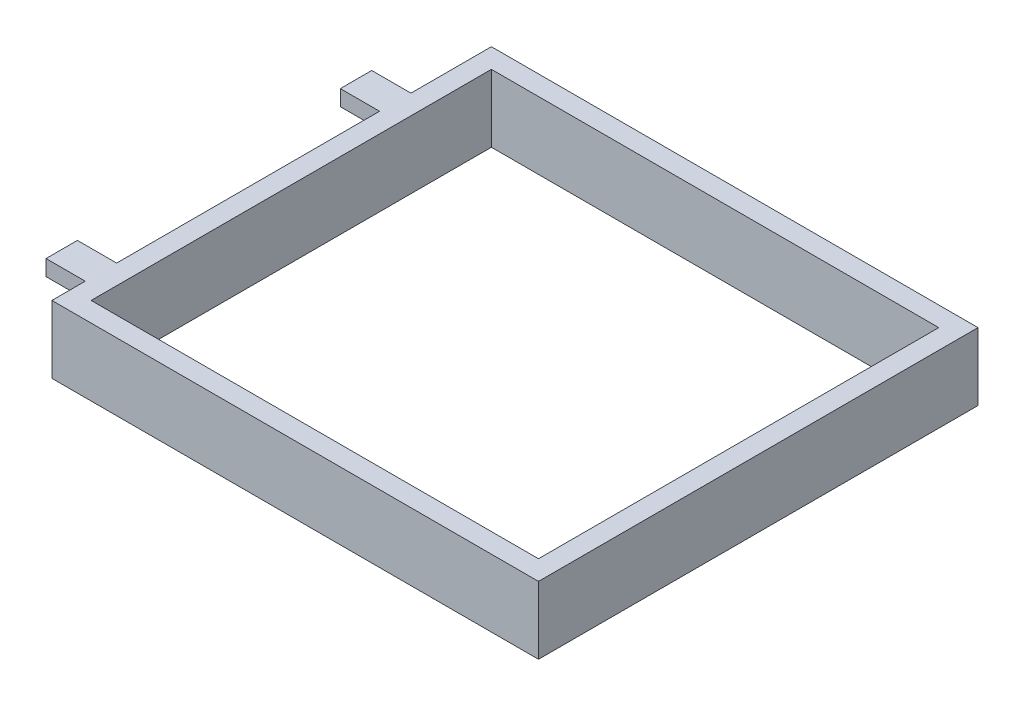
ISO-10303-21;
HEADER;
FILE_DESCRIPTION(('STEP AP214'),'2;1');
FILE_NAME('part.step','',(''),(''),'','','');
FILE_SCHEMA(('AUTOMOTIVE_DESIGN { 1 0 10303 214 1 1 1 1 }'));
ENDSEC;
DATA;
#1=APPLICATION_CONTEXT('core data for automotive mechanical design processes');
#2=APPLICATION_PROTOCOL_DEFINITION('international standard','automotive_design',2000,#1);
#3=PRODUCT_CONTEXT('',#1,'mechanical');
#4=PRODUCT('Part','Part','',(#3));
#5=PRODUCT_RELATED_PRODUCT_CATEGORY('part','',(#4));
#6=PRODUCT_DEFINITION_FORMATION('','',#4);
#7=PRODUCT_DEFINITION_CONTEXT('part definition',#1,'design');
#8=PRODUCT_DEFINITION('design','',#6,#7);
#9=PRODUCT_DEFINITION_SHAPE('','',#8);
#10=(LENGTH_UNIT() NAMED_UNIT(*) SI_UNIT(.MILLI.,.METRE.));
#11=(NAMED_UNIT(*) PLANE_ANGLE_UNIT() SI_UNIT($,.RADIAN.));
#12=(NAMED_UNIT(*) SI_UNIT($,.STERADIAN.) SOLID_ANGLE_UNIT());
#13=UNCERTAINTY_MEASURE_WITH_UNIT(LENGTH_MEASURE(1.E-05),#10,'distance_accuracy_value','');
#14=(GEOMETRIC_REPRESENTATION_CONTEXT(3) GLOBAL_UNCERTAINTY_ASSIGNED_CONTEXT((#13)) GLOBAL_UNIT_ASSIGNED_CONTEXT((#10,
#11,#12)) REPRESENTATION_CONTEXT('',''));
#15=CARTESIAN_POINT('',(0.,0.,0.));
#16=DIRECTION('',(0.,0.,1.));
#17=DIRECTION('',(1.,0.,0.));
#18=AXIS2_PLACEMENT_3D('',#15,#16,#17);
#19=CARTESIAN_POINT('',(0.,43.,0.));
#20=DIRECTION('',(1.,0.,0.));
#21=DIRECTION('',(0.,0.,-1.));
#22=AXIS2_PLACEMENT_3D('',#19,#20,#21);
#23=PLANE('',#22);
#24=DIRECTION('',(0.,-1.,0.));
#25=VECTOR('',#24,1.);
#26=CARTESIAN_POINT('',(0.,43.,-41.25));
#27=LINE('',#26,#25);
#28=CARTESIAN_POINT('',(0.,43.,-41.25));
#29=VERTEX_POINT('',#28);
#30=CARTESIAN_POINT('',(0.,33.,-41.25));
#31=VERTEX_POINT('',#30);
#32=EDGE_CURVE('E170',#29,#31,#27,.T.);
#33=ORIENTED_EDGE('',*,*,#32,.F.);
#34=DIRECTION('',(0.,0.,1.));
#35=VECTOR('',#34,1.);
#36=CARTESIAN_POINT('',(0.,43.,0.));
#37=LINE('',#36,#35);
#38=CARTESIAN_POINT('',(0.,43.,-208.75));
#39=VERTEX_POINT('',#38);
#40=EDGE_CURVE('E239',#39,#29,#37,.T.);
#41=ORIENTED_EDGE('',*,*,#40,.F.);
#42=DIRECTION('',(0.,1.,0.));
#43=VECTOR('',#42,1.);
#44=CARTESIAN_POINT('',(0.,43.,-208.75));
#45=LINE('',#44,#43);
#46=CARTESIAN_POINT('',(0.,33.,-208.75));
#47=VERTEX_POINT('',#46);
#48=EDGE_CURVE('E183',#47,#39,#45,.T.);
#49=ORIENTED_EDGE('',*,*,#48,.F.);
#50=DIRECTION('',(0.,0.,1.));
#51=VECTOR('',#50,1.);
#52=CARTESIAN_POINT('',(0.,33.,-228.75));
#53=LINE('',#52,#51);
#54=CARTESIAN_POINT('',(0.,33.,-228.75));
#55=VERTEX_POINT('',#54);
#56=EDGE_CURVE('E58',#55,#47,#53,.T.);
#57=ORIENTED_EDGE('',*,*,#56,.F.);
#58=DIRECTION('',(0.,-1.,0.));
#59=VECTOR('',#58,1.);
#60=CARTESIAN_POINT('',(0.,43.,-228.75));
#61=LINE('',#60,#59);
#62=CARTESIAN_POINT('',(0.,43.,-228.75));
#63=VERTEX_POINT('',#62);
#64=EDGE_CURVE('E172',#63,#55,#61,.T.);
#65=ORIENTED_EDGE('',*,*,#64,.F.);
#66=CARTESIAN_POINT('',(0.,43.,-280.));
#67=VERTEX_POINT('',#66);
#68=EDGE_CURVE('E235',#67,#63,#37,.T.);
#69=ORIENTED_EDGE('',*,*,#68,.F.);
#70=DIRECTION('',(0.,-1.,0.));
#71=VECTOR('',#70,1.);
#72=CARTESIAN_POINT('',(0.,43.,-280.));
#73=LINE('',#72,#71);
#74=CARTESIAN_POINT('',(0.,0.,-280.));
#75=VERTEX_POINT('',#74);
#76=EDGE_CURVE('E246',#67,#75,#73,.T.);
#77=ORIENTED_EDGE('',*,*,#76,.T.);
#78=DIRECTION('',(0.,0.,1.));
#79=VECTOR('',#78,1.);
#80=CARTESIAN_POINT('',(0.,0.,0.));
#81=LINE('',#80,#79);
#82=CARTESIAN_POINT('',(0.,0.,0.));
#83=VERTEX_POINT('',#82);
#84=EDGE_CURVE('E234',#75,#83,#81,.T.);
#85=ORIENTED_EDGE('',*,*,#84,.T.);
#86=DIRECTION('',(0.,-1.,0.));
#87=VECTOR('',#86,1.);
#88=CARTESIAN_POINT('',(0.,43.,0.));
#89=LINE('',#88,#87);
#90=CARTESIAN_POINT('',(0.,43.,0.));
#91=VERTEX_POINT('',#90);
#92=EDGE_CURVE('E11',#91,#83,#89,.T.);
#93=ORIENTED_EDGE('',*,*,#92,.F.);
#94=CARTESIAN_POINT('',(0.,43.,-21.25));
#95=VERTEX_POINT('',#94);
#96=EDGE_CURVE('E240',#95,#91,#37,.T.);
#97=ORIENTED_EDGE('',*,*,#96,.F.);
#98=DIRECTION('',(0.,1.,0.));
#99=VECTOR('',#98,1.);
#100=CARTESIAN_POINT('',(0.,43.,-21.25));
#101=LINE('',#100,#99);
#102=CARTESIAN_POINT('',(0.,33.,-21.25));
#103=VERTEX_POINT('',#102);
#104=EDGE_CURVE('E166',#103,#95,#101,.T.);
#105=ORIENTED_EDGE('',*,*,#104,.F.);
#106=DIRECTION('',(0.,0.,1.));
#107=VECTOR('',#106,1.);
#108=CARTESIAN_POINT('',(0.,33.,-41.25));
#109=LINE('',#108,#107);
#110=EDGE_CURVE('E328',#31,#103,#109,.T.);
#111=ORIENTED_EDGE('',*,*,#110,.F.);
#112=EDGE_LOOP('',(#33,#41,#49,#57,#65,#69,#77,#85,#93,#97,#105,#111));
#113=FACE_BOUND('',#112,.T.);
#114=ADVANCED_FACE('F36',(#113),#23,.F.);
#115=CARTESIAN_POINT('',(0.,43.,0.));
#116=DIRECTION('',(0.,-1.,0.));
#117=DIRECTION('',(0.,0.,-1.));
#118=AXIS2_PLACEMENT_3D('',#115,#116,#117);
#119=PLANE('',#118);
#120=ORIENTED_EDGE('',*,*,#68,.T.);
#121=DIRECTION('',(1.,0.,0.));
#122=VECTOR('',#121,1.);
#123=CARTESIAN_POINT('',(-25.,43.,-228.75));
#124=LINE('',#123,#122);
#125=CARTESIAN_POINT('',(-25.,43.,-228.75));
#126=VERTEX_POINT('',#125);
#127=EDGE_CURVE('E188',#126,#63,#124,.T.);
#128=ORIENTED_EDGE('',*,*,#127,.F.);
#129=DIRECTION('',(0.,0.,-1.));
#130=VECTOR('',#129,1.);
#131=CARTESIAN_POINT('',(-25.,43.,-228.75));
#132=LINE('',#131,#130);
#133=CARTESIAN_POINT('',(-25.,43.,-208.75));
#134=VERTEX_POINT('',#133);
#135=EDGE_CURVE('E187',#134,#126,#132,.T.);
#136=ORIENTED_EDGE('',*,*,#135,.F.);
#137=DIRECTION('',(1.,0.,0.));
#138=VECTOR('',#137,1.);
#139=CARTESIAN_POINT('',(-25.,43.,-208.75));
#140=LINE('',#139,#138);
#141=EDGE_CURVE('E195',#134,#39,#140,.T.);
#142=ORIENTED_EDGE('',*,*,#141,.T.);
#143=ORIENTED_EDGE('',*,*,#40,.T.);
#144=DIRECTION('',(1.,0.,0.));
#145=VECTOR('',#144,1.);
#146=CARTESIAN_POINT('',(-25.,43.,-41.25));
#147=LINE('',#146,#145);
#148=CARTESIAN_POINT('',(-25.,43.,-41.25));
#149=VERTEX_POINT('',#148);
#150=EDGE_CURVE('E334',#149,#29,#147,.T.);
#151=ORIENTED_EDGE('',*,*,#150,.F.);
#152=DIRECTION('',(0.,0.,-1.));
#153=VECTOR('',#152,1.);
#154=CARTESIAN_POINT('',(-25.,43.,-41.25));
#155=LINE('',#154,#153);
#156=CARTESIAN_POINT('',(-25.,43.,-21.25));
#157=VERTEX_POINT('',#156);
#158=EDGE_CURVE('E163',#157,#149,#155,.T.);
#159=ORIENTED_EDGE('',*,*,#158,.F.);
#160=DIRECTION('',(1.,0.,0.));
#161=VECTOR('',#160,1.);
#162=CARTESIAN_POINT('',(-25.,43.,-21.25));
#163=LINE('',#162,#161);
#164=EDGE_CURVE('E50',#157,#95,#163,.T.);
#165=ORIENTED_EDGE('',*,*,#164,.T.);
#166=ORIENTED_EDGE('',*,*,#96,.T.);
#167=DIRECTION('',(1.,0.,0.));
#168=VECTOR('',#167,1.);
#169=CARTESIAN_POINT('',(0.,43.,0.));
#170=LINE('',#169,#168);
#171=CARTESIAN_POINT('',(310.,43.,0.));
#172=VERTEX_POINT('',#171);
#173=EDGE_CURVE('E238',#91,#172,#170,.T.);
#174=ORIENTED_EDGE('',*,*,#173,.T.);
#175=DIRECTION('',(0.,0.,-1.));
#176=VECTOR('',#175,1.);
#177=CARTESIAN_POINT('',(310.,43.,0.));
#178=LINE('',#177,#176);
#179=CARTESIAN_POINT('',(310.,43.,-280.));
#180=VERTEX_POINT('',#179);
#181=EDGE_CURVE('E242',#172,#180,#178,.T.);
#182=ORIENTED_EDGE('',*,*,#181,.T.);
#183=DIRECTION('',(-1.,0.,0.));
#184=VECTOR('',#183,1.);
#185=CARTESIAN_POINT('',(0.,43.,-280.));
#186=LINE('',#185,#184);
#187=EDGE_CURVE('E244',#180,#67,#186,.T.);
#188=ORIENTED_EDGE('',*,*,#187,.T.);
#189=EDGE_LOOP('',(#120,#128,#136,#142,#143,#151,#159,#165,#166,#174,#182,#188));
#190=FACE_BOUND('',#189,.T.);
#191=DIRECTION('',(0.,0.,1.));
#192=VECTOR('',#191,1.);
#193=CARTESIAN_POINT('',(12.5,43.,-267.5));
#194=LINE('',#193,#192);
#195=CARTESIAN_POINT('',(12.5,43.,-267.5));
#196=VERTEX_POINT('',#195);
#197=CARTESIAN_POINT('',(12.5,43.,-12.5));
#198=VERTEX_POINT('',#197);
#199=EDGE_CURVE('E204',#196,#198,#194,.T.);
#200=ORIENTED_EDGE('',*,*,#199,.F.);
#201=DIRECTION('',(-1.,0.,0.));
#202=VECTOR('',#201,1.);
#203=CARTESIAN_POINT('',(12.5,43.,-267.5));
#204=LINE('',#203,#202);
#205=CARTESIAN_POINT('',(297.5,43.,-267.5));
#206=VERTEX_POINT('',#205);
#207=EDGE_CURVE('E212',#206,#196,#204,.T.);
#208=ORIENTED_EDGE('',*,*,#207,.F.);
#209=DIRECTION('',(0.,0.,-1.));
#210=VECTOR('',#209,1.);
#211=CARTESIAN_POINT('',(297.5,43.,-267.5));
#212=LINE('',#211,#210);
#213=CARTESIAN_POINT('',(297.5,43.,-12.5));
#214=VERTEX_POINT('',#213);
#215=EDGE_CURVE('E209',#214,#206,#212,.T.);
#216=ORIENTED_EDGE('',*,*,#215,.F.);
#217=DIRECTION('',(1.,0.,0.));
#218=VECTOR('',#217,1.);
#219=CARTESIAN_POINT('',(12.5,43.,-12.5));
#220=LINE('',#219,#218);
#221=EDGE_CURVE('E206',#198,#214,#220,.T.);
#222=ORIENTED_EDGE('',*,*,#221,.F.);
#223=EDGE_LOOP('',(#200,#208,#216,#222));
#224=FACE_BOUND('',#223,.T.);
#225=ADVANCED_FACE('F280',(#190,#224),#119,.F.);
#226=CARTESIAN_POINT('',(0.,0.,0.));
#227=DIRECTION('',(0.,-1.,0.));
#228=DIRECTION('',(0.,0.,-1.));
#229=AXIS2_PLACEMENT_3D('',#226,#227,#228);
#230=PLANE('',#229);
#231=ORIENTED_EDGE('',*,*,#84,.F.);
#232=DIRECTION('',(-1.,0.,0.));
#233=VECTOR('',#232,1.);
#234=CARTESIAN_POINT('',(0.,0.,-280.));
#235=LINE('',#234,#233);
#236=CARTESIAN_POINT('',(310.,0.,-280.));
#237=VERTEX_POINT('',#236);
#238=EDGE_CURVE('E253',#237,#75,#235,.T.);
#239=ORIENTED_EDGE('',*,*,#238,.F.);
#240=DIRECTION('',(0.,0.,-1.));
#241=VECTOR('',#240,1.);
#242=CARTESIAN_POINT('',(310.,0.,0.));
#243=LINE('',#242,#241);
#244=CARTESIAN_POINT('',(310.,0.,0.));
#245=VERTEX_POINT('',#244);
#246=EDGE_CURVE('E251',#245,#237,#243,.T.);
#247=ORIENTED_EDGE('',*,*,#246,.F.);
#248=DIRECTION('',(1.,0.,0.));
#249=VECTOR('',#248,1.);
#250=CARTESIAN_POINT('',(0.,0.,0.));
#251=LINE('',#250,#249);
#252=EDGE_CURVE('E249',#83,#245,#251,.T.);
#253=ORIENTED_EDGE('',*,*,#252,.F.);
#254=EDGE_LOOP('',(#231,#239,#247,#253));
#255=FACE_BOUND('',#254,.T.);
#256=DIRECTION('',(-1.,0.,0.));
#257=VECTOR('',#256,1.);
#258=CARTESIAN_POINT('',(12.5,0.,-267.5));
#259=LINE('',#258,#257);
#260=CARTESIAN_POINT('',(297.5,0.,-267.5));
#261=VERTEX_POINT('',#260);
#262=CARTESIAN_POINT('',(12.5,0.,-267.5));
#263=VERTEX_POINT('',#262);
#264=EDGE_CURVE('E207',#261,#263,#259,.T.);
#265=ORIENTED_EDGE('',*,*,#264,.T.);
#266=DIRECTION('',(0.,0.,1.));
#267=VECTOR('',#266,1.);
#268=CARTESIAN_POINT('',(12.5,0.,-267.5));
#269=LINE('',#268,#267);
#270=CARTESIAN_POINT('',(12.5,0.,-12.5));
#271=VERTEX_POINT('',#270);
#272=EDGE_CURVE('E203',#263,#271,#269,.T.);
#273=ORIENTED_EDGE('',*,*,#272,.T.);
#274=DIRECTION('',(1.,0.,0.));
#275=VECTOR('',#274,1.);
#276=CARTESIAN_POINT('',(12.5,0.,-12.5));
#277=LINE('',#276,#275);
#278=CARTESIAN_POINT('',(297.5,0.,-12.5));
#279=VERTEX_POINT('',#278);
#280=EDGE_CURVE('E217',#271,#279,#277,.T.);
#281=ORIENTED_EDGE('',*,*,#280,.T.);
#282=DIRECTION('',(0.,0.,-1.));
#283=VECTOR('',#282,1.);
#284=CARTESIAN_POINT('',(297.5,0.,-267.5));
#285=LINE('',#284,#283);
#286=EDGE_CURVE('E220',#279,#261,#285,.T.);
#287=ORIENTED_EDGE('',*,*,#286,.T.);
#288=EDGE_LOOP('',(#265,#273,#281,#287));
#289=FACE_BOUND('',#288,.T.);
#290=ADVANCED_FACE('F271',(#255,#289),#230,.T.);
#291=CARTESIAN_POINT('',(0.,43.,0.));
#292=DIRECTION('',(0.,0.,-1.));
#293=DIRECTION('',(-1.,0.,0.));
#294=AXIS2_PLACEMENT_3D('',#291,#292,#293);
#295=PLANE('',#294);
#296=ORIENTED_EDGE('',*,*,#252,.T.);
#297=DIRECTION('',(0.,-1.,0.));
#298=VECTOR('',#297,1.);
#299=CARTESIAN_POINT('',(310.,43.,0.));
#300=LINE('',#299,#298);
#301=EDGE_CURVE('E43',#172,#245,#300,.T.);
#302=ORIENTED_EDGE('',*,*,#301,.F.);
#303=ORIENTED_EDGE('',*,*,#173,.F.);
#304=ORIENTED_EDGE('',*,*,#92,.T.);
#305=EDGE_LOOP('',(#296,#302,#303,#304));
#306=FACE_BOUND('',#305,.T.);
#307=ADVANCED_FACE('F314',(#306),#295,.F.);
#308=CARTESIAN_POINT('',(310.,43.,0.));
#309=DIRECTION('',(-1.,0.,0.));
#310=DIRECTION('',(0.,0.,1.));
#311=AXIS2_PLACEMENT_3D('',#308,#309,#310);
#312=PLANE('',#311);
#313=ORIENTED_EDGE('',*,*,#246,.T.);
#314=DIRECTION('',(0.,-1.,0.));
#315=VECTOR('',#314,1.);
#316=CARTESIAN_POINT('',(310.,43.,-280.));
#317=LINE('',#316,#315);
#318=EDGE_CURVE('E257',#180,#237,#317,.T.);
#319=ORIENTED_EDGE('',*,*,#318,.F.);
#320=ORIENTED_EDGE('',*,*,#181,.F.);
#321=ORIENTED_EDGE('',*,*,#301,.T.);
#322=EDGE_LOOP('',(#313,#319,#320,#321));
#323=FACE_BOUND('',#322,.T.);
#324=ADVANCED_FACE('F264',(#323),#312,.F.);
#325=CARTESIAN_POINT('',(0.,43.,-280.));
#326=DIRECTION('',(0.,0.,1.));
#327=DIRECTION('',(1.,0.,0.));
#328=AXIS2_PLACEMENT_3D('',#325,#326,#327);
#329=PLANE('',#328);
#330=ORIENTED_EDGE('',*,*,#238,.T.);
#331=ORIENTED_EDGE('',*,*,#76,.F.);
#332=ORIENTED_EDGE('',*,*,#187,.F.);
#333=ORIENTED_EDGE('',*,*,#318,.T.);
#334=EDGE_LOOP('',(#330,#331,#332,#333));
#335=FACE_BOUND('',#334,.T.);
#336=ADVANCED_FACE('F275',(#335),#329,.F.);
#337=CARTESIAN_POINT('',(12.5,43.,-267.5));
#338=DIRECTION('',(1.,0.,0.));
#339=DIRECTION('',(0.,0.,-1.));
#340=AXIS2_PLACEMENT_3D('',#337,#338,#339);
#341=PLANE('',#340);
#342=ORIENTED_EDGE('',*,*,#272,.F.);
#343=DIRECTION('',(0.,-1.,0.));
#344=VECTOR('',#343,1.);
#345=CARTESIAN_POINT('',(12.5,43.,-267.5));
#346=LINE('',#345,#344);
#347=EDGE_CURVE('E214',#196,#263,#346,.T.);
#348=ORIENTED_EDGE('',*,*,#347,.F.);
#349=ORIENTED_EDGE('',*,*,#199,.T.);
#350=DIRECTION('',(0.,-1.,0.));
#351=VECTOR('',#350,1.);
#352=CARTESIAN_POINT('',(12.5,43.,-12.5));
#353=LINE('',#352,#351);
#354=EDGE_CURVE('E231',#198,#271,#353,.T.);
#355=ORIENTED_EDGE('',*,*,#354,.T.);
#356=EDGE_LOOP('',(#342,#348,#349,#355));
#357=FACE_BOUND('',#356,.T.);
#358=ADVANCED_FACE('F317',(#357),#341,.T.);
#359=CARTESIAN_POINT('',(12.5,43.,-12.5));
#360=DIRECTION('',(0.,0.,-1.));
#361=DIRECTION('',(-1.,0.,0.));
#362=AXIS2_PLACEMENT_3D('',#359,#360,#361);
#363=PLANE('',#362);
#364=ORIENTED_EDGE('',*,*,#280,.F.);
#365=ORIENTED_EDGE('',*,*,#354,.F.);
#366=ORIENTED_EDGE('',*,*,#221,.T.);
#367=DIRECTION('',(0.,-1.,0.));
#368=VECTOR('',#367,1.);
#369=CARTESIAN_POINT('',(297.5,43.,-12.5));
#370=LINE('',#369,#368);
#371=EDGE_CURVE('E229',#214,#279,#370,.T.);
#372=ORIENTED_EDGE('',*,*,#371,.T.);
#373=EDGE_LOOP('',(#364,#365,#366,#372));
#374=FACE_BOUND('',#373,.T.);
#375=ADVANCED_FACE('F420',(#374),#363,.T.);
#376=CARTESIAN_POINT('',(297.5,43.,-267.5));
#377=DIRECTION('',(-1.,0.,0.));
#378=DIRECTION('',(0.,0.,1.));
#379=AXIS2_PLACEMENT_3D('',#376,#377,#378);
#380=PLANE('',#379);
#381=ORIENTED_EDGE('',*,*,#286,.F.);
#382=ORIENTED_EDGE('',*,*,#371,.F.);
#383=ORIENTED_EDGE('',*,*,#215,.T.);
#384=DIRECTION('',(0.,-1.,0.));
#385=VECTOR('',#384,1.);
#386=CARTESIAN_POINT('',(297.5,43.,-267.5));
#387=LINE('',#386,#385);
#388=EDGE_CURVE('E227',#206,#261,#387,.T.);
#389=ORIENTED_EDGE('',*,*,#388,.T.);
#390=EDGE_LOOP('',(#381,#382,#383,#389));
#391=FACE_BOUND('',#390,.T.);
#392=ADVANCED_FACE('F410',(#391),#380,.T.);
#393=CARTESIAN_POINT('',(12.5,43.,-267.5));
#394=DIRECTION('',(0.,0.,1.));
#395=DIRECTION('',(1.,0.,0.));
#396=AXIS2_PLACEMENT_3D('',#393,#394,#395);
#397=PLANE('',#396);
#398=ORIENTED_EDGE('',*,*,#264,.F.);
#399=ORIENTED_EDGE('',*,*,#388,.F.);
#400=ORIENTED_EDGE('',*,*,#207,.T.);
#401=ORIENTED_EDGE('',*,*,#347,.T.);
#402=EDGE_LOOP('',(#398,#399,#400,#401));
#403=FACE_BOUND('',#402,.T.);
#404=ADVANCED_FACE('F304',(#403),#397,.T.);
#405=CARTESIAN_POINT('',(-25.,43.,-228.75));
#406=DIRECTION('',(0.,0.,1.));
#407=DIRECTION('',(1.,0.,0.));
#408=AXIS2_PLACEMENT_3D('',#405,#406,#407);
#409=PLANE('',#408);
#410=ORIENTED_EDGE('',*,*,#64,.T.);
#411=DIRECTION('',(1.,0.,0.));
#412=VECTOR('',#411,1.);
#413=CARTESIAN_POINT('',(-25.,33.,-228.75));
#414=LINE('',#413,#412);
#415=CARTESIAN_POINT('',(-25.,33.,-228.75));
#416=VERTEX_POINT('',#415);
#417=EDGE_CURVE('E201',#416,#55,#414,.T.);
#418=ORIENTED_EDGE('',*,*,#417,.F.);
#419=DIRECTION('',(0.,-1.,0.));
#420=VECTOR('',#419,1.);
#421=CARTESIAN_POINT('',(-25.,43.,-228.75));
#422=LINE('',#421,#420);
#423=EDGE_CURVE('E179',#126,#416,#422,.T.);
#424=ORIENTED_EDGE('',*,*,#423,.F.);
#425=ORIENTED_EDGE('',*,*,#127,.T.);
#426=EDGE_LOOP('',(#410,#418,#424,#425));
#427=FACE_BOUND('',#426,.T.);
#428=ADVANCED_FACE('F285',(#427),#409,.F.);
#429=CARTESIAN_POINT('',(-25.,33.,-228.75));
#430=DIRECTION('',(0.,1.,0.));
#431=DIRECTION('',(0.,0.,1.));
#432=AXIS2_PLACEMENT_3D('',#429,#430,#431);
#433=PLANE('',#432);
#434=ORIENTED_EDGE('',*,*,#56,.T.);
#435=DIRECTION('',(1.,0.,0.));
#436=VECTOR('',#435,1.);
#437=CARTESIAN_POINT('',(-25.,33.,-208.75));
#438=LINE('',#437,#436);
#439=CARTESIAN_POINT('',(-25.,33.,-208.75));
#440=VERTEX_POINT('',#439);
#441=EDGE_CURVE('E198',#440,#47,#438,.T.);
#442=ORIENTED_EDGE('',*,*,#441,.F.);
#443=DIRECTION('',(0.,0.,1.));
#444=VECTOR('',#443,1.);
#445=CARTESIAN_POINT('',(-25.,33.,-228.75));
#446=LINE('',#445,#444);
#447=EDGE_CURVE('E182',#416,#440,#446,.T.);
#448=ORIENTED_EDGE('',*,*,#447,.F.);
#449=ORIENTED_EDGE('',*,*,#417,.T.);
#450=EDGE_LOOP('',(#434,#442,#448,#449));
#451=FACE_BOUND('',#450,.T.);
#452=ADVANCED_FACE('F296',(#451),#433,.F.);
#453=CARTESIAN_POINT('',(-25.,43.,-208.75));
#454=DIRECTION('',(0.,0.,-1.));
#455=DIRECTION('',(-1.,0.,0.));
#456=AXIS2_PLACEMENT_3D('',#453,#454,#455);
#457=PLANE('',#456);
#458=ORIENTED_EDGE('',*,*,#48,.T.);
#459=ORIENTED_EDGE('',*,*,#141,.F.);
#460=DIRECTION('',(0.,1.,0.));
#461=VECTOR('',#460,1.);
#462=CARTESIAN_POINT('',(-25.,43.,-208.75));
#463=LINE('',#462,#461);
#464=EDGE_CURVE('E185',#440,#134,#463,.T.);
#465=ORIENTED_EDGE('',*,*,#464,.F.);
#466=ORIENTED_EDGE('',*,*,#441,.T.);
#467=EDGE_LOOP('',(#458,#459,#465,#466));
#468=FACE_BOUND('',#467,.T.);
#469=ADVANCED_FACE('F294',(#468),#457,.F.);
#470=CARTESIAN_POINT('',(-25.,0.,0.));
#471=DIRECTION('',(-1.,0.,0.));
#472=DIRECTION('',(0.,0.,1.));
#473=AXIS2_PLACEMENT_3D('',#470,#471,#472);
#474=PLANE('',#473);
#475=ORIENTED_EDGE('',*,*,#423,.T.);
#476=ORIENTED_EDGE('',*,*,#447,.T.);
#477=ORIENTED_EDGE('',*,*,#464,.T.);
#478=ORIENTED_EDGE('',*,*,#135,.T.);
#479=EDGE_LOOP('',(#475,#476,#477,#478));
#480=FACE_BOUND('',#479,.T.);
#481=ADVANCED_FACE('F288',(#480),#474,.T.);
#482=CARTESIAN_POINT('',(-25.,43.,-41.25));
#483=DIRECTION('',(0.,0.,1.));
#484=DIRECTION('',(1.,0.,0.));
#485=AXIS2_PLACEMENT_3D('',#482,#483,#484);
#486=PLANE('',#485);
#487=ORIENTED_EDGE('',*,*,#32,.T.);
#488=DIRECTION('',(1.,0.,0.));
#489=VECTOR('',#488,1.);
#490=CARTESIAN_POINT('',(-25.,33.,-41.25));
#491=LINE('',#490,#489);
#492=CARTESIAN_POINT('',(-25.,33.,-41.25));
#493=VERTEX_POINT('',#492);
#494=EDGE_CURVE('E152',#493,#31,#491,.T.);
#495=ORIENTED_EDGE('',*,*,#494,.F.);
#496=DIRECTION('',(0.,-1.,0.));
#497=VECTOR('',#496,1.);
#498=CARTESIAN_POINT('',(-25.,43.,-41.25));
#499=LINE('',#498,#497);
#500=EDGE_CURVE('E159',#149,#493,#499,.T.);
#501=ORIENTED_EDGE('',*,*,#500,.F.);
#502=ORIENTED_EDGE('',*,*,#150,.T.);
#503=EDGE_LOOP('',(#487,#495,#501,#502));
#504=FACE_BOUND('',#503,.T.);
#505=ADVANCED_FACE('F168',(#504),#486,.F.);
#506=CARTESIAN_POINT('',(-25.,33.,-41.25));
#507=DIRECTION('',(0.,1.,0.));
#508=DIRECTION('',(0.,0.,1.));
#509=AXIS2_PLACEMENT_3D('',#506,#507,#508);
#510=PLANE('',#509);
#511=ORIENTED_EDGE('',*,*,#110,.T.);
#512=DIRECTION('',(1.,0.,0.));
#513=VECTOR('',#512,1.);
#514=CARTESIAN_POINT('',(-25.,33.,-21.25));
#515=LINE('',#514,#513);
#516=CARTESIAN_POINT('',(-25.,33.,-21.25));
#517=VERTEX_POINT('',#516);
#518=EDGE_CURVE('E155',#517,#103,#515,.T.);
#519=ORIENTED_EDGE('',*,*,#518,.F.);
#520=DIRECTION('',(0.,0.,1.));
#521=VECTOR('',#520,1.);
#522=CARTESIAN_POINT('',(-25.,33.,-41.25));
#523=LINE('',#522,#521);
#524=EDGE_CURVE('E148',#493,#517,#523,.T.);
#525=ORIENTED_EDGE('',*,*,#524,.F.);
#526=ORIENTED_EDGE('',*,*,#494,.T.);
#527=EDGE_LOOP('',(#511,#519,#525,#526));
#528=FACE_BOUND('',#527,.T.);
#529=ADVANCED_FACE('F150',(#528),#510,.F.);
#530=CARTESIAN_POINT('',(-25.,43.,-21.25));
#531=DIRECTION('',(0.,0.,-1.));
#532=DIRECTION('',(0.,1.,0.));
#533=AXIS2_PLACEMENT_3D('',#530,#531,#532);
#534=PLANE('',#533);
#535=ORIENTED_EDGE('',*,*,#104,.T.);
#536=ORIENTED_EDGE('',*,*,#164,.F.);
#537=DIRECTION('',(0.,1.,0.));
#538=VECTOR('',#537,1.);
#539=CARTESIAN_POINT('',(-25.,43.,-21.25));
#540=LINE('',#539,#538);
#541=EDGE_CURVE('E158',#517,#157,#540,.T.);
#542=ORIENTED_EDGE('',*,*,#541,.F.);
#543=ORIENTED_EDGE('',*,*,#518,.T.);
#544=EDGE_LOOP('',(#535,#536,#542,#543));
#545=FACE_BOUND('',#544,.T.);
#546=ADVANCED_FACE('F337',(#545),#534,.F.);
#547=CARTESIAN_POINT('',(-25.,0.,0.));
#548=DIRECTION('',(-1.,0.,0.));
#549=DIRECTION('',(0.,0.,1.));
#550=AXIS2_PLACEMENT_3D('',#547,#548,#549);
#551=PLANE('',#550);
#552=ORIENTED_EDGE('',*,*,#500,.T.);
#553=ORIENTED_EDGE('',*,*,#524,.T.);
#554=ORIENTED_EDGE('',*,*,#541,.T.);
#555=ORIENTED_EDGE('',*,*,#158,.T.);
#556=EDGE_LOOP('',(#552,#553,#554,#555));
#557=FACE_BOUND('',#556,.T.);
#558=ADVANCED_FACE('F162',(#557),#551,.T.);
#559=CLOSED_SHELL('',(#114,#225,#290,#307,#324,#336,#358,#375,#392,#404,#428,#452,#469,#481,
#505,#529,#546,#558));
#560=MANIFOLD_SOLID_BREP('B2',#559);
#561=ADVANCED_BREP_SHAPE_REPRESENTATION('',(#18,#560),#14);
#562=SHAPE_DEFINITION_REPRESENTATION(#9,#561);
ENDSEC;
END-ISO-10303-21;
